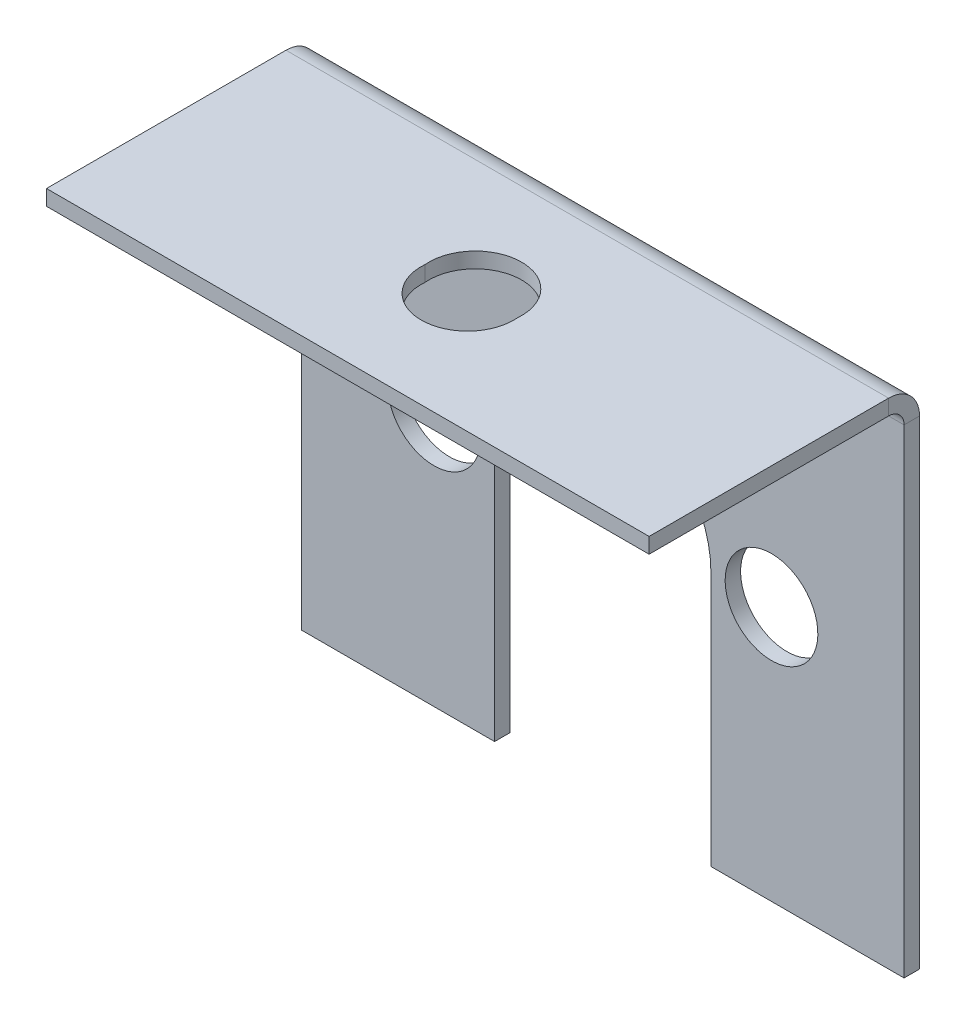
ISO-10303-21;
HEADER;
FILE_DESCRIPTION(('STEP AP214'),'2;1');
FILE_NAME('part.step','',(''),(''),'','','');
FILE_SCHEMA(('AUTOMOTIVE_DESIGN { 1 0 10303 214 1 1 1 1 }'));
ENDSEC;
DATA;
#1=APPLICATION_CONTEXT('core data for automotive mechanical design processes');
#2=APPLICATION_PROTOCOL_DEFINITION('international standard','automotive_design',2000,#1);
#3=PRODUCT_CONTEXT('',#1,'mechanical');
#4=PRODUCT('Part','Part','',(#3));
#5=PRODUCT_RELATED_PRODUCT_CATEGORY('part','',(#4));
#6=PRODUCT_DEFINITION_FORMATION('','',#4);
#7=PRODUCT_DEFINITION_CONTEXT('part definition',#1,'design');
#8=PRODUCT_DEFINITION('design','',#6,#7);
#9=PRODUCT_DEFINITION_SHAPE('','',#8);
#10=(LENGTH_UNIT() NAMED_UNIT(*) SI_UNIT(.MILLI.,.METRE.));
#11=(NAMED_UNIT(*) PLANE_ANGLE_UNIT() SI_UNIT($,.RADIAN.));
#12=(NAMED_UNIT(*) SI_UNIT($,.STERADIAN.) SOLID_ANGLE_UNIT());
#13=UNCERTAINTY_MEASURE_WITH_UNIT(LENGTH_MEASURE(1.E-05),#10,'distance_accuracy_value','');
#14=(GEOMETRIC_REPRESENTATION_CONTEXT(3) GLOBAL_UNCERTAINTY_ASSIGNED_CONTEXT((#13)) GLOBAL_UNIT_ASSIGNED_CONTEXT((#10,
#11,#12)) REPRESENTATION_CONTEXT('',''));
#15=CARTESIAN_POINT('',(0.,0.,0.));
#16=DIRECTION('',(0.,0.,1.));
#17=DIRECTION('',(1.,0.,0.));
#18=AXIS2_PLACEMENT_3D('',#15,#16,#17);
#19=CARTESIAN_POINT('',(19.5000000000003,25.4508798646362,8.25));
#20=DIRECTION('',(0.,1.,0.));
#21=DIRECTION('',(0.,0.,1.));
#22=AXIS2_PLACEMENT_3D('',#19,#20,#21);
#23=PLANE('',#22);
#24=DIRECTION('',(0.,0.,-1.));
#25=VECTOR('',#24,1.);
#26=CARTESIAN_POINT('',(2.08166817117217E-13,25.4508798646362,8.25));
#27=LINE('',#26,#25);
#28=CARTESIAN_POINT('',(2.08166817117217E-13,25.4508798646362,8.25));
#29=VERTEX_POINT('',#28);
#30=CARTESIAN_POINT('',(2.08166817117217E-13,25.4508798646362,0.5));
#31=VERTEX_POINT('',#30);
#32=EDGE_CURVE('E237',#29,#31,#27,.T.);
#33=ORIENTED_EDGE('',*,*,#32,.F.);
#34=DIRECTION('',(-1.00000000000001,0.,0.));
#35=VECTOR('',#34,1.);
#36=CARTESIAN_POINT('',(19.5000000000003,25.4508798646362,8.25));
#37=LINE('',#36,#35);
#38=CARTESIAN_POINT('',(19.5000000000003,25.4508798646362,8.25));
#39=VERTEX_POINT('',#38);
#40=EDGE_CURVE('E255',#39,#29,#37,.T.);
#41=ORIENTED_EDGE('',*,*,#40,.F.);
#42=DIRECTION('',(0.,0.,-1.));
#43=VECTOR('',#42,1.);
#44=CARTESIAN_POINT('',(19.5000000000003,25.4508798646362,8.25));
#45=LINE('',#44,#43);
#46=CARTESIAN_POINT('',(19.5000000000003,25.4508798646362,0.5));
#47=VERTEX_POINT('',#46);
#48=EDGE_CURVE('E213',#39,#47,#45,.T.);
#49=ORIENTED_EDGE('',*,*,#48,.T.);
#50=DIRECTION('',(-1.00000000000001,0.,0.));
#51=VECTOR('',#50,1.);
#52=CARTESIAN_POINT('',(19.5000000000003,25.4508798646362,0.5));
#53=LINE('',#52,#51);
#54=EDGE_CURVE('E257',#47,#31,#53,.T.);
#55=ORIENTED_EDGE('',*,*,#54,.T.);
#56=EDGE_LOOP('',(#33,#41,#49,#55));
#57=FACE_BOUND('',#56,.T.);
#58=CARTESIAN_POINT('',(9.75000000000015,25.4508798646362,4.375));
#59=DIRECTION('',(0.,1.,0.));
#60=DIRECTION('',(0.,0.,1.));
#61=AXIS2_PLACEMENT_3D('',#58,#59,#60);
#62=CIRCLE('',#61,1.5);
#63=CARTESIAN_POINT('',(8.25521740711248,25.4508798646362,4.24999999999998));
#64=VERTEX_POINT('',#63);
#65=CARTESIAN_POINT('',(11.2447825928878,25.4508798646362,4.25));
#66=VERTEX_POINT('',#65);
#67=EDGE_CURVE('E156',#64,#66,#62,.T.);
#68=ORIENTED_EDGE('',*,*,#67,.F.);
#69=CARTESIAN_POINT('',(9.75000000000016,25.4508798646362,4.125));
#70=DIRECTION('',(0.,1.,0.));
#71=DIRECTION('',(0.,0.,1.));
#72=AXIS2_PLACEMENT_3D('',#69,#70,#71);
#73=CIRCLE('',#72,1.5);
#74=EDGE_CURVE('E144',#66,#64,#73,.T.);
#75=ORIENTED_EDGE('',*,*,#74,.F.);
#76=EDGE_LOOP('',(#68,#75));
#77=FACE_BOUND('',#76,.T.);
#78=ADVANCED_FACE('F46',(#57,#77),#23,.T.);
#79=CARTESIAN_POINT('',(19.5000000000003,24.9508798646362,8.25));
#80=DIRECTION('',(0.,1.,0.));
#81=DIRECTION('',(0.,0.,1.));
#82=AXIS2_PLACEMENT_3D('',#79,#80,#81);
#83=PLANE('',#82);
#84=DIRECTION('',(0.,0.,-1.));
#85=VECTOR('',#84,1.);
#86=CARTESIAN_POINT('',(2.08166817117217E-13,24.9508798646362,8.25));
#87=LINE('',#86,#85);
#88=CARTESIAN_POINT('',(2.08166817117217E-13,24.9508798646362,8.25));
#89=VERTEX_POINT('',#88);
#90=CARTESIAN_POINT('',(2.08166817117217E-13,24.9508798646362,0.5));
#91=VERTEX_POINT('',#90);
#92=EDGE_CURVE('E243',#89,#91,#87,.T.);
#93=ORIENTED_EDGE('',*,*,#92,.T.);
#94=DIRECTION('',(-1.00000000000001,0.,0.));
#95=VECTOR('',#94,1.);
#96=CARTESIAN_POINT('',(19.5000000000003,24.9508798646362,0.5));
#97=LINE('',#96,#95);
#98=CARTESIAN_POINT('',(19.5000000000003,24.9508798646362,0.5));
#99=VERTEX_POINT('',#98);
#100=EDGE_CURVE('E250',#99,#91,#97,.T.);
#101=ORIENTED_EDGE('',*,*,#100,.F.);
#102=DIRECTION('',(0.,0.,-1.));
#103=VECTOR('',#102,1.);
#104=CARTESIAN_POINT('',(19.5000000000003,24.9508798646362,8.25));
#105=LINE('',#104,#103);
#106=CARTESIAN_POINT('',(19.5000000000003,24.9508798646362,8.25));
#107=VERTEX_POINT('',#106);
#108=EDGE_CURVE('E219',#107,#99,#105,.T.);
#109=ORIENTED_EDGE('',*,*,#108,.F.);
#110=DIRECTION('',(-1.00000000000001,0.,0.));
#111=VECTOR('',#110,1.);
#112=CARTESIAN_POINT('',(19.5000000000003,24.9508798646362,8.25));
#113=LINE('',#112,#111);
#114=EDGE_CURVE('E253',#107,#89,#113,.T.);
#115=ORIENTED_EDGE('',*,*,#114,.T.);
#116=EDGE_LOOP('',(#93,#101,#109,#115));
#117=FACE_BOUND('',#116,.T.);
#118=CARTESIAN_POINT('',(9.75000000000016,24.9508798646362,4.125));
#119=DIRECTION('',(0.,1.,0.));
#120=DIRECTION('',(0.,0.,1.));
#121=AXIS2_PLACEMENT_3D('',#118,#119,#120);
#122=CIRCLE('',#121,1.5);
#123=CARTESIAN_POINT('',(11.2447825928878,24.9508798646362,4.25));
#124=VERTEX_POINT('',#123);
#125=CARTESIAN_POINT('',(8.25521740711248,24.9508798646362,4.24999999999998));
#126=VERTEX_POINT('',#125);
#127=EDGE_CURVE('E61',#124,#126,#122,.T.);
#128=ORIENTED_EDGE('',*,*,#127,.T.);
#129=CARTESIAN_POINT('',(9.75000000000015,24.9508798646362,4.375));
#130=DIRECTION('',(0.,1.,0.));
#131=DIRECTION('',(0.,0.,1.));
#132=AXIS2_PLACEMENT_3D('',#129,#130,#131);
#133=CIRCLE('',#132,1.5);
#134=EDGE_CURVE('E158',#126,#124,#133,.T.);
#135=ORIENTED_EDGE('',*,*,#134,.T.);
#136=EDGE_LOOP('',(#128,#135));
#137=FACE_BOUND('',#136,.T.);
#138=ADVANCED_FACE('F318',(#117,#137),#83,.F.);
#139=CARTESIAN_POINT('',(9.75000000000015,24.9508798646362,4.375));
#140=DIRECTION('',(0.,1.,0.));
#141=DIRECTION('',(0.,0.,1.));
#142=AXIS2_PLACEMENT_3D('',#139,#140,#141);
#143=CYLINDRICAL_SURFACE('',#142,1.5);
#144=DIRECTION('',(0.,-1.,0.));
#145=VECTOR('',#144,1.);
#146=CARTESIAN_POINT('',(8.25521740711248,24.9508798646362,4.24999999999998));
#147=LINE('',#146,#145);
#148=EDGE_CURVE('E147',#126,#64,#147,.F.);
#149=ORIENTED_EDGE('',*,*,#148,.T.);
#150=ORIENTED_EDGE('',*,*,#67,.T.);
#151=DIRECTION('',(0.,-1.,0.));
#152=VECTOR('',#151,1.);
#153=CARTESIAN_POINT('',(11.2447825928878,24.9508798646362,4.25));
#154=LINE('',#153,#152);
#155=EDGE_CURVE('E148',#124,#66,#154,.F.);
#156=ORIENTED_EDGE('',*,*,#155,.F.);
#157=ORIENTED_EDGE('',*,*,#134,.F.);
#158=EDGE_LOOP('',(#149,#150,#156,#157));
#159=FACE_BOUND('',#158,.T.);
#160=ADVANCED_FACE('F155',(#159),#143,.F.);
#161=CARTESIAN_POINT('',(19.5000000000003,24.9508798646362,0.));
#162=DIRECTION('',(0.,0.,-1.));
#163=DIRECTION('',(0.,1.,0.));
#164=AXIS2_PLACEMENT_3D('',#161,#162,#163);
#165=PLANE('',#164);
#166=DIRECTION('',(-1.00000000000001,0.,0.));
#167=VECTOR('',#166,1.);
#168=CARTESIAN_POINT('',(19.5000000000002,8.95087986463627,0.));
#169=LINE('',#168,#167);
#170=CARTESIAN_POINT('',(6.25,8.95087986463622,0.));
#171=VERTEX_POINT('',#170);
#172=CARTESIAN_POINT('',(1.04083408558608E-13,8.95087986463622,0.));
#173=VERTEX_POINT('',#172);
#174=EDGE_CURVE('E267',#171,#173,#169,.T.);
#175=ORIENTED_EDGE('',*,*,#174,.F.);
#176=DIRECTION('',(0.,1.,0.));
#177=VECTOR('',#176,1.);
#178=CARTESIAN_POINT('',(6.2500000000001,16.7008798646362,0.));
#179=LINE('',#178,#177);
#180=CARTESIAN_POINT('',(6.2500000000001,17.2008798646362,0.));
#181=VERTEX_POINT('',#180);
#182=EDGE_CURVE('E176',#171,#181,#179,.T.);
#183=ORIENTED_EDGE('',*,*,#182,.T.);
#184=CARTESIAN_POINT('',(9.7500000000001,17.2008798646363,0.));
#185=DIRECTION('',(0.,0.,-1.));
#186=DIRECTION('',(0.,1.,0.));
#187=AXIS2_PLACEMENT_3D('',#184,#185,#186);
#188=CIRCLE('',#187,3.5);
#189=CARTESIAN_POINT('',(13.2500000000002,17.2008798646363,0.));
#190=VERTEX_POINT('',#189);
#191=EDGE_CURVE('E179',#181,#190,#188,.T.);
#192=ORIENTED_EDGE('',*,*,#191,.T.);
#193=DIRECTION('',(0.,-1.,0.));
#194=VECTOR('',#193,1.);
#195=CARTESIAN_POINT('',(13.2500000000002,16.7008798646363,0.));
#196=LINE('',#195,#194);
#197=CARTESIAN_POINT('',(13.2500000000002,8.95087986463627,0.));
#198=VERTEX_POINT('',#197);
#199=EDGE_CURVE('E183',#190,#198,#196,.T.);
#200=ORIENTED_EDGE('',*,*,#199,.T.);
#201=CARTESIAN_POINT('',(19.5000000000002,8.95087986463627,0.));
#202=VERTEX_POINT('',#201);
#203=EDGE_CURVE('E268',#202,#198,#169,.T.);
#204=ORIENTED_EDGE('',*,*,#203,.F.);
#205=DIRECTION('',(0.,-1.,0.));
#206=VECTOR('',#205,1.);
#207=CARTESIAN_POINT('',(19.5000000000003,24.9508798646362,0.));
#208=LINE('',#207,#206);
#209=CARTESIAN_POINT('',(19.5000000000003,24.4508798646362,0.));
#210=VERTEX_POINT('',#209);
#211=EDGE_CURVE('E201',#210,#202,#208,.T.);
#212=ORIENTED_EDGE('',*,*,#211,.F.);
#213=DIRECTION('',(-1.00000000000001,0.,0.));
#214=VECTOR('',#213,1.);
#215=CARTESIAN_POINT('',(19.5000000000003,24.4508798646362,0.));
#216=LINE('',#215,#214);
#217=CARTESIAN_POINT('',(2.08166817117217E-13,24.4508798646362,0.));
#218=VERTEX_POINT('',#217);
#219=EDGE_CURVE('E225',#210,#218,#216,.T.);
#220=ORIENTED_EDGE('',*,*,#219,.T.);
#221=DIRECTION('',(0.,-1.,0.));
#222=VECTOR('',#221,1.);
#223=CARTESIAN_POINT('',(2.08166817117217E-13,24.9508798646362,0.));
#224=LINE('',#223,#222);
#225=EDGE_CURVE('E194',#218,#173,#224,.T.);
#226=ORIENTED_EDGE('',*,*,#225,.T.);
#227=EDGE_LOOP('',(#175,#183,#192,#200,#204,#212,#220,#226));
#228=FACE_BOUND('',#227,.T.);
#229=CARTESIAN_POINT('',(15.2100000000002,17.2008798646362,0.));
#230=DIRECTION('',(0.,0.,-1.));
#231=DIRECTION('',(0.,1.,0.));
#232=AXIS2_PLACEMENT_3D('',#229,#230,#231);
#233=CIRCLE('',#232,1.5);
#234=CARTESIAN_POINT('',(15.2100000000002,18.7008798646362,0.));
#235=VERTEX_POINT('',#234);
#236=EDGE_CURVE('E171',#235,#235,#233,.T.);
#237=ORIENTED_EDGE('',*,*,#236,.T.);
#238=EDGE_LOOP('',(#237));
#239=FACE_BOUND('',#238,.T.);
#240=CARTESIAN_POINT('',(4.29000000000005,17.2008798646362,0.));
#241=DIRECTION('',(0.,0.,-1.));
#242=DIRECTION('',(0.,1.,0.));
#243=AXIS2_PLACEMENT_3D('',#240,#241,#242);
#244=CIRCLE('',#243,1.5);
#245=CARTESIAN_POINT('',(4.29000000000006,18.7008798646362,0.));
#246=VERTEX_POINT('',#245);
#247=EDGE_CURVE('E165',#246,#246,#244,.F.);
#248=ORIENTED_EDGE('',*,*,#247,.F.);
#249=EDGE_LOOP('',(#248));
#250=FACE_BOUND('',#249,.T.);
#251=ADVANCED_FACE('F291',(#228,#239,#250),#165,.F.);
#252=CARTESIAN_POINT('',(19.5000000000003,24.9508798646362,-0.5));
#253=DIRECTION('',(0.,0.,-1.));
#254=DIRECTION('',(0.,1.,0.));
#255=AXIS2_PLACEMENT_3D('',#252,#253,#254);
#256=PLANE('',#255);
#257=DIRECTION('',(0.,1.,0.));
#258=VECTOR('',#257,1.);
#259=CARTESIAN_POINT('',(6.2500000000001,16.7008798646362,-0.5));
#260=LINE('',#259,#258);
#261=CARTESIAN_POINT('',(6.25,8.95087986463622,-0.5));
#262=VERTEX_POINT('',#261);
#263=CARTESIAN_POINT('',(6.2500000000001,17.2008798646362,-0.5));
#264=VERTEX_POINT('',#263);
#265=EDGE_CURVE('E69',#262,#264,#260,.T.);
#266=ORIENTED_EDGE('',*,*,#265,.F.);
#267=DIRECTION('',(-1.00000000000001,0.,0.));
#268=VECTOR('',#267,1.);
#269=CARTESIAN_POINT('',(19.5000000000002,8.95087986463627,-0.5));
#270=LINE('',#269,#268);
#271=CARTESIAN_POINT('',(1.04083408558608E-13,8.95087986463622,-0.5));
#272=VERTEX_POINT('',#271);
#273=EDGE_CURVE('E263',#262,#272,#270,.T.);
#274=ORIENTED_EDGE('',*,*,#273,.T.);
#275=DIRECTION('',(0.,-1.,0.));
#276=VECTOR('',#275,1.);
#277=CARTESIAN_POINT('',(2.08166817117217E-13,24.9508798646362,-0.5));
#278=LINE('',#277,#276);
#279=CARTESIAN_POINT('',(2.08166817117217E-13,24.4508798646362,-0.5));
#280=VERTEX_POINT('',#279);
#281=EDGE_CURVE('E231',#280,#272,#278,.T.);
#282=ORIENTED_EDGE('',*,*,#281,.F.);
#283=DIRECTION('',(-1.00000000000001,0.,0.));
#284=VECTOR('',#283,1.);
#285=CARTESIAN_POINT('',(19.5000000000003,24.4508798646362,-0.5));
#286=LINE('',#285,#284);
#287=CARTESIAN_POINT('',(19.5000000000003,24.4508798646362,-0.5));
#288=VERTEX_POINT('',#287);
#289=EDGE_CURVE('E260',#288,#280,#286,.T.);
#290=ORIENTED_EDGE('',*,*,#289,.F.);
#291=DIRECTION('',(0.,-1.,0.));
#292=VECTOR('',#291,1.);
#293=CARTESIAN_POINT('',(19.5000000000003,24.9508798646362,-0.5));
#294=LINE('',#293,#292);
#295=CARTESIAN_POINT('',(19.5000000000002,8.95087986463627,-0.5));
#296=VERTEX_POINT('',#295);
#297=EDGE_CURVE('E207',#288,#296,#294,.T.);
#298=ORIENTED_EDGE('',*,*,#297,.T.);
#299=CARTESIAN_POINT('',(13.2500000000002,8.95087986463627,-0.5));
#300=VERTEX_POINT('',#299);
#301=EDGE_CURVE('E264',#296,#300,#270,.T.);
#302=ORIENTED_EDGE('',*,*,#301,.T.);
#303=DIRECTION('',(0.,-1.,0.));
#304=VECTOR('',#303,1.);
#305=CARTESIAN_POINT('',(13.2500000000002,16.7008798646363,-0.5));
#306=LINE('',#305,#304);
#307=CARTESIAN_POINT('',(13.2500000000002,17.2008798646363,-0.5));
#308=VERTEX_POINT('',#307);
#309=EDGE_CURVE('E180',#308,#300,#306,.T.);
#310=ORIENTED_EDGE('',*,*,#309,.F.);
#311=CARTESIAN_POINT('',(9.7500000000001,17.2008798646363,-0.5));
#312=DIRECTION('',(0.,0.,-1.));
#313=DIRECTION('',(0.,1.,0.));
#314=AXIS2_PLACEMENT_3D('',#311,#312,#313);
#315=CIRCLE('',#314,3.5);
#316=EDGE_CURVE('E188',#264,#308,#315,.T.);
#317=ORIENTED_EDGE('',*,*,#316,.F.);
#318=EDGE_LOOP('',(#266,#274,#282,#290,#298,#302,#310,#317));
#319=FACE_BOUND('',#318,.T.);
#320=CARTESIAN_POINT('',(15.2100000000002,17.2008798646362,-0.5));
#321=DIRECTION('',(0.,0.,-1.));
#322=DIRECTION('',(0.,1.,0.));
#323=AXIS2_PLACEMENT_3D('',#320,#321,#322);
#324=CIRCLE('',#323,1.5);
#325=CARTESIAN_POINT('',(15.2100000000002,18.7008798646362,-0.499999999999998));
#326=VERTEX_POINT('',#325);
#327=EDGE_CURVE('E168',#326,#326,#324,.T.);
#328=ORIENTED_EDGE('',*,*,#327,.F.);
#329=EDGE_LOOP('',(#328));
#330=FACE_BOUND('',#329,.T.);
#331=CARTESIAN_POINT('',(4.29000000000005,17.2008798646362,-0.5));
#332=DIRECTION('',(0.,0.,-1.));
#333=DIRECTION('',(0.,1.,0.));
#334=AXIS2_PLACEMENT_3D('',#331,#332,#333);
#335=CIRCLE('',#334,1.5);
#336=CARTESIAN_POINT('',(4.29000000000006,18.7008798646362,-0.499999999999998));
#337=VERTEX_POINT('',#336);
#338=EDGE_CURVE('E161',#337,#337,#335,.F.);
#339=ORIENTED_EDGE('',*,*,#338,.T.);
#340=EDGE_LOOP('',(#339));
#341=FACE_BOUND('',#340,.T.);
#342=ADVANCED_FACE('F297',(#319,#330,#341),#256,.T.);
#343=CARTESIAN_POINT('',(19.5000000000002,8.95087986463627,-0.5));
#344=DIRECTION('',(0.,-1.,0.));
#345=DIRECTION('',(0.,0.,-1.));
#346=AXIS2_PLACEMENT_3D('',#343,#344,#345);
#347=PLANE('',#346);
#348=DIRECTION('',(0.,0.,-1.));
#349=VECTOR('',#348,1.);
#350=CARTESIAN_POINT('',(6.25,8.95087986463622,0.));
#351=LINE('',#350,#349);
#352=EDGE_CURVE('E192',#171,#262,#351,.T.);
#353=ORIENTED_EDGE('',*,*,#352,.F.);
#354=ORIENTED_EDGE('',*,*,#174,.T.);
#355=DIRECTION('',(0.,0.,1.));
#356=VECTOR('',#355,1.);
#357=CARTESIAN_POINT('',(1.04083408558608E-13,8.95087986463622,-0.5));
#358=LINE('',#357,#356);
#359=EDGE_CURVE('E228',#272,#173,#358,.T.);
#360=ORIENTED_EDGE('',*,*,#359,.F.);
#361=ORIENTED_EDGE('',*,*,#273,.F.);
#362=EDGE_LOOP('',(#353,#354,#360,#361));
#363=FACE_BOUND('',#362,.T.);
#364=ADVANCED_FACE('F327',(#363),#347,.T.);
#365=CARTESIAN_POINT('',(19.5000000000003,24.9508798646362,0.5));
#366=DIRECTION('',(1.00000000000001,0.,0.));
#367=DIRECTION('',(0.,0.,-1.));
#368=AXIS2_PLACEMENT_3D('',#365,#366,#367);
#369=PLANE('',#368);
#370=DIRECTION('',(0.,1.,0.));
#371=VECTOR('',#370,1.);
#372=CARTESIAN_POINT('',(19.5000000000003,24.9508798646362,0.5));
#373=LINE('',#372,#371);
#374=EDGE_CURVE('E13',#99,#47,#373,.T.);
#375=ORIENTED_EDGE('',*,*,#374,.F.);
#376=CARTESIAN_POINT('',(19.5000000000003,24.4508798646362,0.5));
#377=DIRECTION('',(1.00000000000001,0.,0.));
#378=DIRECTION('',(0.,0.,-1.));
#379=AXIS2_PLACEMENT_3D('',#376,#377,#378);
#380=CIRCLE('',#379,0.5);
#381=EDGE_CURVE('E222',#99,#210,#380,.F.);
#382=ORIENTED_EDGE('',*,*,#381,.T.);
#383=DIRECTION('',(0.,0.,1.));
#384=VECTOR('',#383,1.);
#385=CARTESIAN_POINT('',(19.5000000000003,24.4508798646362,-0.5));
#386=LINE('',#385,#384);
#387=EDGE_CURVE('E54',#288,#210,#386,.T.);
#388=ORIENTED_EDGE('',*,*,#387,.F.);
#389=CARTESIAN_POINT('',(19.5000000000003,24.4508798646362,0.5));
#390=DIRECTION('',(1.00000000000001,0.,0.));
#391=DIRECTION('',(0.,0.,-1.));
#392=AXIS2_PLACEMENT_3D('',#389,#390,#391);
#393=CIRCLE('',#392,1.);
#394=EDGE_CURVE('E210',#47,#288,#393,.F.);
#395=ORIENTED_EDGE('',*,*,#394,.F.);
#396=EDGE_LOOP('',(#375,#382,#388,#395));
#397=FACE_BOUND('',#396,.T.);
#398=ADVANCED_FACE('F48',(#397),#369,.T.);
#399=CARTESIAN_POINT('',(19.5000000000003,24.4508798646362,-0.5));
#400=DIRECTION('',(1.00000000000001,0.,0.));
#401=DIRECTION('',(0.,0.,-1.));
#402=AXIS2_PLACEMENT_3D('',#399,#400,#401);
#403=PLANE('',#402);
#404=ORIENTED_EDGE('',*,*,#108,.T.);
#405=ORIENTED_EDGE('',*,*,#374,.T.);
#406=ORIENTED_EDGE('',*,*,#48,.F.);
#407=DIRECTION('',(0.,1.,0.));
#408=VECTOR('',#407,1.);
#409=CARTESIAN_POINT('',(19.5000000000003,24.9508798646362,8.25));
#410=LINE('',#409,#408);
#411=EDGE_CURVE('E216',#107,#39,#410,.T.);
#412=ORIENTED_EDGE('',*,*,#411,.F.);
#413=EDGE_LOOP('',(#404,#405,#406,#412));
#414=FACE_BOUND('',#413,.T.);
#415=ADVANCED_FACE('F310',(#414),#403,.T.);
#416=CARTESIAN_POINT('',(2.08166817117217E-13,24.4508798646362,0.));
#417=DIRECTION('',(-1.00000000000001,0.,0.));
#418=DIRECTION('',(0.,0.,1.));
#419=AXIS2_PLACEMENT_3D('',#416,#417,#418);
#420=PLANE('',#419);
#421=DIRECTION('',(0.,0.,-1.));
#422=VECTOR('',#421,1.);
#423=CARTESIAN_POINT('',(2.08166817117217E-13,24.4508798646362,0.));
#424=LINE('',#423,#422);
#425=EDGE_CURVE('E273',#218,#280,#424,.T.);
#426=ORIENTED_EDGE('',*,*,#425,.F.);
#427=CARTESIAN_POINT('',(2.08166817117217E-13,24.4508798646362,0.5));
#428=DIRECTION('',(1.00000000000001,0.,0.));
#429=DIRECTION('',(0.,0.,-1.));
#430=AXIS2_PLACEMENT_3D('',#427,#428,#429);
#431=CIRCLE('',#430,0.5);
#432=EDGE_CURVE('E204',#91,#218,#431,.F.);
#433=ORIENTED_EDGE('',*,*,#432,.F.);
#434=DIRECTION('',(0.,-1.,0.));
#435=VECTOR('',#434,1.);
#436=CARTESIAN_POINT('',(2.08166817117217E-13,25.4508798646362,0.5));
#437=LINE('',#436,#435);
#438=EDGE_CURVE('E271',#31,#91,#437,.T.);
#439=ORIENTED_EDGE('',*,*,#438,.F.);
#440=CARTESIAN_POINT('',(2.08166817117217E-13,24.4508798646362,0.5));
#441=DIRECTION('',(1.00000000000001,0.,0.));
#442=DIRECTION('',(0.,0.,-1.));
#443=AXIS2_PLACEMENT_3D('',#440,#441,#442);
#444=CIRCLE('',#443,1.);
#445=EDGE_CURVE('E234',#31,#280,#444,.F.);
#446=ORIENTED_EDGE('',*,*,#445,.T.);
#447=EDGE_LOOP('',(#426,#433,#439,#446));
#448=FACE_BOUND('',#447,.T.);
#449=ADVANCED_FACE('F321',(#448),#420,.T.);
#450=CARTESIAN_POINT('',(2.08166817117217E-13,25.4508798646362,0.5));
#451=DIRECTION('',(-1.00000000000001,0.,0.));
#452=DIRECTION('',(0.,0.,1.));
#453=AXIS2_PLACEMENT_3D('',#450,#451,#452);
#454=PLANE('',#453);
#455=ORIENTED_EDGE('',*,*,#225,.F.);
#456=ORIENTED_EDGE('',*,*,#425,.T.);
#457=ORIENTED_EDGE('',*,*,#281,.T.);
#458=ORIENTED_EDGE('',*,*,#359,.T.);
#459=EDGE_LOOP('',(#455,#456,#457,#458));
#460=FACE_BOUND('',#459,.T.);
#461=ADVANCED_FACE('F323',(#460),#454,.T.);
#462=DIRECTION('',(0.,0.,-1.));
#463=VECTOR('',#462,1.);
#464=CARTESIAN_POINT('',(13.2500000000002,8.95087986463627,0.));
#465=LINE('',#464,#463);
#466=EDGE_CURVE('E195',#198,#300,#465,.T.);
#467=ORIENTED_EDGE('',*,*,#466,.T.);
#468=ORIENTED_EDGE('',*,*,#301,.F.);
#469=DIRECTION('',(0.,0.,1.));
#470=VECTOR('',#469,1.);
#471=CARTESIAN_POINT('',(19.5000000000002,8.95087986463627,-0.5));
#472=LINE('',#471,#470);
#473=EDGE_CURVE('E203',#296,#202,#472,.T.);
#474=ORIENTED_EDGE('',*,*,#473,.T.);
#475=ORIENTED_EDGE('',*,*,#203,.T.);
#476=EDGE_LOOP('',(#467,#468,#474,#475));
#477=FACE_BOUND('',#476,.T.);
#478=ADVANCED_FACE('F295',(#477),#347,.T.);
#479=CARTESIAN_POINT('',(19.5000000000003,24.4508798646362,0.5));
#480=DIRECTION('',(-1.00000000000001,0.,0.));
#481=DIRECTION('',(0.,0.,1.));
#482=AXIS2_PLACEMENT_3D('',#479,#480,#481);
#483=CYLINDRICAL_SURFACE('',#482,1.);
#484=ORIENTED_EDGE('',*,*,#445,.F.);
#485=ORIENTED_EDGE('',*,*,#54,.F.);
#486=ORIENTED_EDGE('',*,*,#394,.T.);
#487=ORIENTED_EDGE('',*,*,#289,.T.);
#488=EDGE_LOOP('',(#484,#485,#486,#487));
#489=FACE_BOUND('',#488,.T.);
#490=ADVANCED_FACE('F303',(#489),#483,.T.);
#491=CARTESIAN_POINT('',(19.5000000000003,24.9508798646362,8.25));
#492=DIRECTION('',(0.,0.,1.));
#493=DIRECTION('',(1.00000000000001,0.,0.));
#494=AXIS2_PLACEMENT_3D('',#491,#492,#493);
#495=PLANE('',#494);
#496=DIRECTION('',(0.,1.,0.));
#497=VECTOR('',#496,1.);
#498=CARTESIAN_POINT('',(2.08166817117217E-13,24.9508798646362,8.25));
#499=LINE('',#498,#497);
#500=EDGE_CURVE('E240',#89,#29,#499,.T.);
#501=ORIENTED_EDGE('',*,*,#500,.F.);
#502=ORIENTED_EDGE('',*,*,#114,.F.);
#503=ORIENTED_EDGE('',*,*,#411,.T.);
#504=ORIENTED_EDGE('',*,*,#40,.T.);
#505=EDGE_LOOP('',(#501,#502,#503,#504));
#506=FACE_BOUND('',#505,.T.);
#507=ADVANCED_FACE('F313',(#506),#495,.T.);
#508=CARTESIAN_POINT('',(19.5000000000003,24.4508798646362,0.5));
#509=DIRECTION('',(-1.00000000000001,0.,0.));
#510=DIRECTION('',(0.,0.,1.));
#511=AXIS2_PLACEMENT_3D('',#508,#509,#510);
#512=CYLINDRICAL_SURFACE('',#511,0.5);
#513=ORIENTED_EDGE('',*,*,#432,.T.);
#514=ORIENTED_EDGE('',*,*,#219,.F.);
#515=ORIENTED_EDGE('',*,*,#381,.F.);
#516=ORIENTED_EDGE('',*,*,#100,.T.);
#517=EDGE_LOOP('',(#513,#514,#515,#516));
#518=FACE_BOUND('',#517,.T.);
#519=ADVANCED_FACE('F286',(#518),#512,.F.);
#520=CARTESIAN_POINT('',(19.5000000000003,24.4508798646362,0.5));
#521=DIRECTION('',(1.00000000000001,0.,0.));
#522=DIRECTION('',(0.,0.,-1.));
#523=AXIS2_PLACEMENT_3D('',#520,#521,#522);
#524=PLANE('',#523);
#525=ORIENTED_EDGE('',*,*,#211,.T.);
#526=ORIENTED_EDGE('',*,*,#473,.F.);
#527=ORIENTED_EDGE('',*,*,#297,.F.);
#528=ORIENTED_EDGE('',*,*,#387,.T.);
#529=EDGE_LOOP('',(#525,#526,#527,#528));
#530=FACE_BOUND('',#529,.T.);
#531=ADVANCED_FACE('F276',(#530),#524,.T.);
#532=CARTESIAN_POINT('',(2.08166817117217E-13,24.4508798646362,0.5));
#533=DIRECTION('',(1.00000000000001,0.,0.));
#534=DIRECTION('',(0.,0.,-1.));
#535=AXIS2_PLACEMENT_3D('',#532,#533,#534);
#536=PLANE('',#535);
#537=ORIENTED_EDGE('',*,*,#32,.T.);
#538=ORIENTED_EDGE('',*,*,#438,.T.);
#539=ORIENTED_EDGE('',*,*,#92,.F.);
#540=ORIENTED_EDGE('',*,*,#500,.T.);
#541=EDGE_LOOP('',(#537,#538,#539,#540));
#542=FACE_BOUND('',#541,.T.);
#543=ADVANCED_FACE('F344',(#542),#536,.F.);
#544=CARTESIAN_POINT('',(6.2500000000001,16.7008798646362,0.));
#545=DIRECTION('',(-1.00000000000001,0.,0.));
#546=DIRECTION('',(0.,0.,1.));
#547=AXIS2_PLACEMENT_3D('',#544,#545,#546);
#548=PLANE('',#547);
#549=ORIENTED_EDGE('',*,*,#265,.T.);
#550=DIRECTION('',(0.,0.,-1.));
#551=VECTOR('',#550,1.);
#552=CARTESIAN_POINT('',(6.2500000000001,17.2008798646362,0.));
#553=LINE('',#552,#551);
#554=EDGE_CURVE('E186',#181,#264,#553,.T.);
#555=ORIENTED_EDGE('',*,*,#554,.F.);
#556=ORIENTED_EDGE('',*,*,#182,.F.);
#557=ORIENTED_EDGE('',*,*,#352,.T.);
#558=EDGE_LOOP('',(#549,#555,#556,#557));
#559=FACE_BOUND('',#558,.T.);
#560=ADVANCED_FACE('F329',(#559),#548,.F.);
#561=CARTESIAN_POINT('',(13.2500000000002,16.7008798646363,0.));
#562=DIRECTION('',(1.00000000000001,0.,0.));
#563=DIRECTION('',(0.,0.,-1.));
#564=AXIS2_PLACEMENT_3D('',#561,#562,#563);
#565=PLANE('',#564);
#566=ORIENTED_EDGE('',*,*,#309,.T.);
#567=ORIENTED_EDGE('',*,*,#466,.F.);
#568=ORIENTED_EDGE('',*,*,#199,.F.);
#569=DIRECTION('',(0.,0.,-1.));
#570=VECTOR('',#569,1.);
#571=CARTESIAN_POINT('',(13.2500000000002,17.2008798646363,0.));
#572=LINE('',#571,#570);
#573=EDGE_CURVE('E198',#190,#308,#572,.T.);
#574=ORIENTED_EDGE('',*,*,#573,.T.);
#575=EDGE_LOOP('',(#566,#567,#568,#574));
#576=FACE_BOUND('',#575,.T.);
#577=ADVANCED_FACE('F335',(#576),#565,.F.);
#578=CARTESIAN_POINT('',(9.7500000000001,17.2008798646363,0.));
#579=DIRECTION('',(0.,0.,-1.));
#580=DIRECTION('',(0.,1.,0.));
#581=AXIS2_PLACEMENT_3D('',#578,#579,#580);
#582=CYLINDRICAL_SURFACE('',#581,3.5);
#583=ORIENTED_EDGE('',*,*,#316,.T.);
#584=ORIENTED_EDGE('',*,*,#573,.F.);
#585=ORIENTED_EDGE('',*,*,#191,.F.);
#586=ORIENTED_EDGE('',*,*,#554,.T.);
#587=EDGE_LOOP('',(#583,#584,#585,#586));
#588=FACE_BOUND('',#587,.T.);
#589=ADVANCED_FACE('F332',(#588),#582,.F.);
#590=CARTESIAN_POINT('',(15.2100000000002,17.2008798646362,0.));
#591=DIRECTION('',(0.,0.,-1.));
#592=DIRECTION('',(0.,1.,0.));
#593=AXIS2_PLACEMENT_3D('',#590,#591,#592);
#594=CYLINDRICAL_SURFACE('',#593,1.5);
#595=ORIENTED_EDGE('',*,*,#236,.F.);
#596=EDGE_LOOP('',(#595));
#597=FACE_BOUND('',#596,.T.);
#598=ORIENTED_EDGE('',*,*,#327,.T.);
#599=EDGE_LOOP('',(#598));
#600=FACE_BOUND('',#599,.T.);
#601=ADVANCED_FACE('F342',(#597,#600),#594,.F.);
#602=CARTESIAN_POINT('',(4.29000000000005,17.2008798646362,0.));
#603=DIRECTION('',(0.,0.,-1.));
#604=DIRECTION('',(0.,1.,0.));
#605=AXIS2_PLACEMENT_3D('',#602,#603,#604);
#606=CYLINDRICAL_SURFACE('',#605,1.5);
#607=ORIENTED_EDGE('',*,*,#247,.T.);
#608=EDGE_LOOP('',(#607));
#609=FACE_BOUND('',#608,.T.);
#610=ORIENTED_EDGE('',*,*,#338,.F.);
#611=EDGE_LOOP('',(#610));
#612=FACE_BOUND('',#611,.T.);
#613=ADVANCED_FACE('F407',(#609,#612),#606,.F.);
#614=CARTESIAN_POINT('',(9.75000000000016,24.9508798646362,4.125));
#615=DIRECTION('',(0.,1.,0.));
#616=DIRECTION('',(0.,0.,1.));
#617=AXIS2_PLACEMENT_3D('',#614,#615,#616);
#618=CYLINDRICAL_SURFACE('',#617,1.5);
#619=ORIENTED_EDGE('',*,*,#148,.F.);
#620=ORIENTED_EDGE('',*,*,#127,.F.);
#621=ORIENTED_EDGE('',*,*,#155,.T.);
#622=ORIENTED_EDGE('',*,*,#74,.T.);
#623=EDGE_LOOP('',(#619,#620,#621,#622));
#624=FACE_BOUND('',#623,.T.);
#625=ADVANCED_FACE('F146',(#624),#618,.F.);
#626=CLOSED_SHELL('',(#78,#138,#160,#251,#342,#364,#398,#415,#449,#461,#478,#490,#507,#519,#531,
#543,#560,#577,#589,#601,#613,#625));
#627=MANIFOLD_SOLID_BREP('B2',#626);
#628=ADVANCED_BREP_SHAPE_REPRESENTATION('',(#18,#627),#14);
#629=SHAPE_DEFINITION_REPRESENTATION(#9,#628);
ENDSEC;
END-ISO-10303-21;
